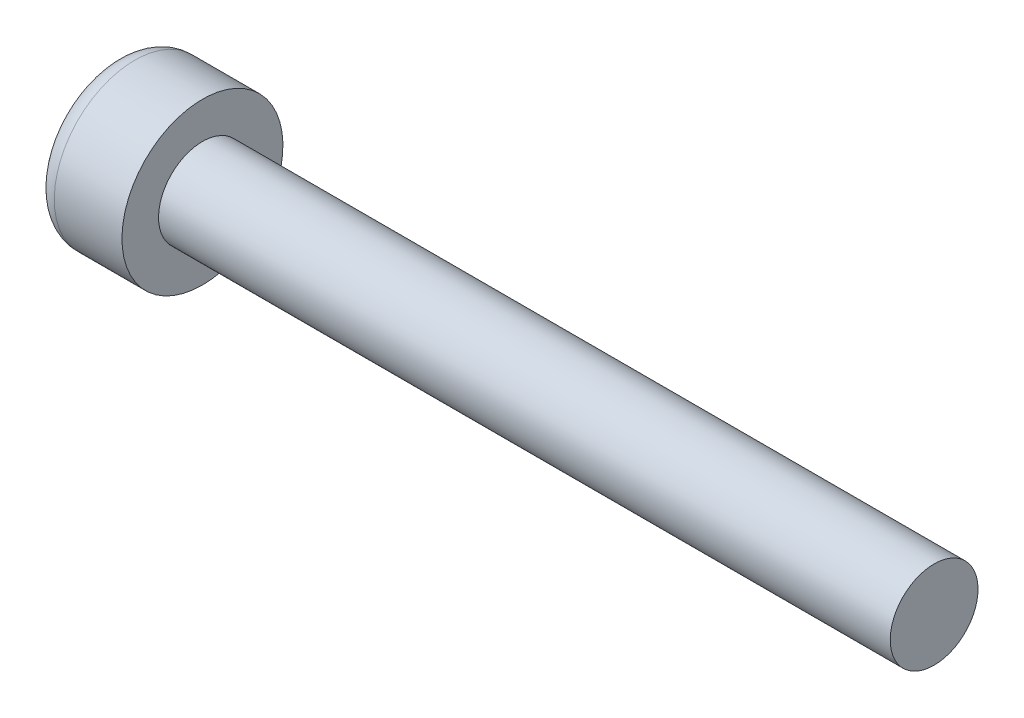
ISO-10303-21;
HEADER;
FILE_DESCRIPTION(('STEP AP214'),'2;1');
FILE_NAME('part.step','',(''),(''),'','','');
FILE_SCHEMA(('AUTOMOTIVE_DESIGN { 1 0 10303 214 1 1 1 1 }'));
ENDSEC;
DATA;
#1=APPLICATION_CONTEXT('core data for automotive mechanical design processes');
#2=APPLICATION_PROTOCOL_DEFINITION('international standard','automotive_design',2000,#1);
#3=PRODUCT_CONTEXT('',#1,'mechanical');
#4=PRODUCT('Part','Part','',(#3));
#5=PRODUCT_RELATED_PRODUCT_CATEGORY('part','',(#4));
#6=PRODUCT_DEFINITION_FORMATION('','',#4);
#7=PRODUCT_DEFINITION_CONTEXT('part definition',#1,'design');
#8=PRODUCT_DEFINITION('design','',#6,#7);
#9=PRODUCT_DEFINITION_SHAPE('','',#8);
#10=(LENGTH_UNIT() NAMED_UNIT(*) SI_UNIT(.MILLI.,.METRE.));
#11=(NAMED_UNIT(*) PLANE_ANGLE_UNIT() SI_UNIT($,.RADIAN.));
#12=(NAMED_UNIT(*) SI_UNIT($,.STERADIAN.) SOLID_ANGLE_UNIT());
#13=UNCERTAINTY_MEASURE_WITH_UNIT(LENGTH_MEASURE(1.E-05),#10,'distance_accuracy_value','');
#14=(GEOMETRIC_REPRESENTATION_CONTEXT(3) GLOBAL_UNCERTAINTY_ASSIGNED_CONTEXT((#13)) GLOBAL_UNIT_ASSIGNED_CONTEXT((#10,
#11,#12)) REPRESENTATION_CONTEXT('',''));
#15=CARTESIAN_POINT('',(0.,0.,0.));
#16=DIRECTION('',(0.,0.,1.));
#17=DIRECTION('',(1.,0.,0.));
#18=AXIS2_PLACEMENT_3D('',#15,#16,#17);
#19=CARTESIAN_POINT('',(0.,0.,0.));
#20=DIRECTION('',(1.,0.,0.));
#21=DIRECTION('',(0.,1.,0.));
#22=AXIS2_PLACEMENT_3D('',#19,#20,#21);
#23=PLANE('',#22);
#24=DIRECTION('',(0.,-0.5,-0.866025403784438));
#25=VECTOR('',#24,1.);
#26=CARTESIAN_POINT('',(0.,1.44337567297406,0.));
#27=LINE('',#26,#25);
#28=CARTESIAN_POINT('',(0.,1.44337567297406,0.));
#29=VERTEX_POINT('',#28);
#30=CARTESIAN_POINT('',(0.,0.721687836487031,-1.25));
#31=VERTEX_POINT('',#30);
#32=EDGE_CURVE('E121',#29,#31,#27,.T.);
#33=ORIENTED_EDGE('',*,*,#32,.F.);
#34=DIRECTION('',(0.,0.5,-0.866025403784439));
#35=VECTOR('',#34,1.);
#36=CARTESIAN_POINT('',(0.,0.721687836487032,1.25));
#37=LINE('',#36,#35);
#38=CARTESIAN_POINT('',(0.,0.721687836487032,1.25));
#39=VERTEX_POINT('',#38);
#40=EDGE_CURVE('E47',#39,#29,#37,.T.);
#41=ORIENTED_EDGE('',*,*,#40,.F.);
#42=DIRECTION('',(0.,1.,0.));
#43=VECTOR('',#42,1.);
#44=CARTESIAN_POINT('',(0.,-0.721687836487031,1.25));
#45=LINE('',#44,#43);
#46=CARTESIAN_POINT('',(0.,-0.721687836487031,1.25));
#47=VERTEX_POINT('',#46);
#48=EDGE_CURVE('E130',#47,#39,#45,.T.);
#49=ORIENTED_EDGE('',*,*,#48,.F.);
#50=DIRECTION('',(0.,0.5,0.866025403784439));
#51=VECTOR('',#50,1.);
#52=CARTESIAN_POINT('',(0.,-1.44337567297406,0.));
#53=LINE('',#52,#51);
#54=CARTESIAN_POINT('',(0.,-1.44337567297406,0.));
#55=VERTEX_POINT('',#54);
#56=EDGE_CURVE('E128',#55,#47,#53,.T.);
#57=ORIENTED_EDGE('',*,*,#56,.F.);
#58=DIRECTION('',(0.,-0.5,0.866025403784438));
#59=VECTOR('',#58,1.);
#60=CARTESIAN_POINT('',(0.,-0.721687836487032,-1.25));
#61=LINE('',#60,#59);
#62=CARTESIAN_POINT('',(0.,-0.721687836487032,-1.25));
#63=VERTEX_POINT('',#62);
#64=EDGE_CURVE('E95',#63,#55,#61,.T.);
#65=ORIENTED_EDGE('',*,*,#64,.F.);
#66=DIRECTION('',(0.,-1.,0.));
#67=VECTOR('',#66,1.);
#68=CARTESIAN_POINT('',(0.,0.721687836487031,-1.25));
#69=LINE('',#68,#67);
#70=EDGE_CURVE('E124',#31,#63,#69,.T.);
#71=ORIENTED_EDGE('',*,*,#70,.F.);
#72=EDGE_LOOP('',(#33,#41,#49,#57,#65,#71));
#73=FACE_BOUND('',#72,.T.);
#74=CARTESIAN_POINT('',(0.,0.,0.));
#75=DIRECTION('',(-1.,0.,0.));
#76=DIRECTION('',(0.,-1.,0.));
#77=AXIS2_PLACEMENT_3D('',#74,#75,#76);
#78=CIRCLE('',#77,2.0625);
#79=CARTESIAN_POINT('',(0.,-2.0625,0.));
#80=VERTEX_POINT('',#79);
#81=EDGE_CURVE('E11',#80,#80,#78,.T.);
#82=ORIENTED_EDGE('',*,*,#81,.T.);
#83=EDGE_LOOP('',(#82));
#84=FACE_BOUND('',#83,.T.);
#85=ADVANCED_FACE('F33',(#73,#84),#23,.F.);
#86=CARTESIAN_POINT('',(0.6875,0.,0.));
#87=DIRECTION('',(-1.,0.,0.));
#88=DIRECTION('',(0.,-1.,0.));
#89=AXIS2_PLACEMENT_3D('',#86,#87,#88);
#90=TOROIDAL_SURFACE('',#89,2.0625,0.6875);
#91=ORIENTED_EDGE('',*,*,#81,.F.);
#92=EDGE_LOOP('',(#91));
#93=FACE_BOUND('',#92,.T.);
#94=CARTESIAN_POINT('',(0.6875,0.,0.));
#95=DIRECTION('',(-1.,0.,0.));
#96=DIRECTION('',(0.,-1.,0.));
#97=AXIS2_PLACEMENT_3D('',#94,#95,#96);
#98=CIRCLE('',#97,2.75);
#99=CARTESIAN_POINT('',(0.687500000000001,-2.75,0.));
#100=VERTEX_POINT('',#99);
#101=EDGE_CURVE('E40',#100,#100,#98,.T.);
#102=ORIENTED_EDGE('',*,*,#101,.T.);
#103=EDGE_LOOP('',(#102));
#104=FACE_BOUND('',#103,.T.);
#105=ADVANCED_FACE('F150',(#93,#104),#90,.T.);
#106=CARTESIAN_POINT('',(0.,0.,0.));
#107=DIRECTION('',(-1.,0.,0.));
#108=DIRECTION('',(0.,-1.,0.));
#109=AXIS2_PLACEMENT_3D('',#106,#107,#108);
#110=CYLINDRICAL_SURFACE('',#109,2.75);
#111=ORIENTED_EDGE('',*,*,#101,.F.);
#112=EDGE_LOOP('',(#111));
#113=FACE_BOUND('',#112,.T.);
#114=CARTESIAN_POINT('',(3.,0.,0.));
#115=DIRECTION('',(-1.,0.,0.));
#116=DIRECTION('',(0.,-1.,0.));
#117=AXIS2_PLACEMENT_3D('',#114,#115,#116);
#118=CIRCLE('',#117,2.75);
#119=CARTESIAN_POINT('',(3.,-2.75,0.));
#120=VERTEX_POINT('',#119);
#121=EDGE_CURVE('E145',#120,#120,#118,.T.);
#122=ORIENTED_EDGE('',*,*,#121,.T.);
#123=EDGE_LOOP('',(#122));
#124=FACE_BOUND('',#123,.T.);
#125=ADVANCED_FACE('F152',(#113,#124),#110,.T.);
#126=CARTESIAN_POINT('',(3.,2.75,0.));
#127=DIRECTION('',(-1.,0.,0.));
#128=DIRECTION('',(0.,-1.,0.));
#129=AXIS2_PLACEMENT_3D('',#126,#127,#128);
#130=PLANE('',#129);
#131=ORIENTED_EDGE('',*,*,#121,.F.);
#132=EDGE_LOOP('',(#131));
#133=FACE_BOUND('',#132,.T.);
#134=CARTESIAN_POINT('',(3.,0.,0.));
#135=DIRECTION('',(-1.,0.,0.));
#136=DIRECTION('',(0.,-1.,0.));
#137=AXIS2_PLACEMENT_3D('',#134,#135,#136);
#138=CIRCLE('',#137,1.5);
#139=CARTESIAN_POINT('',(3.,-1.5,0.));
#140=VERTEX_POINT('',#139);
#141=EDGE_CURVE('E142',#140,#140,#138,.T.);
#142=ORIENTED_EDGE('',*,*,#141,.T.);
#143=EDGE_LOOP('',(#142));
#144=FACE_BOUND('',#143,.T.);
#145=ADVANCED_FACE('F155',(#133,#144),#130,.F.);
#146=CARTESIAN_POINT('',(0.,0.,0.));
#147=DIRECTION('',(-1.,0.,0.));
#148=DIRECTION('',(0.,-1.,0.));
#149=AXIS2_PLACEMENT_3D('',#146,#147,#148);
#150=CYLINDRICAL_SURFACE('',#149,1.5);
#151=ORIENTED_EDGE('',*,*,#141,.F.);
#152=EDGE_LOOP('',(#151));
#153=FACE_BOUND('',#152,.T.);
#154=CARTESIAN_POINT('',(28.,0.,0.));
#155=DIRECTION('',(-1.,0.,0.));
#156=DIRECTION('',(0.,-1.,0.));
#157=AXIS2_PLACEMENT_3D('',#154,#155,#156);
#158=CIRCLE('',#157,1.49999999999999);
#159=CARTESIAN_POINT('',(28.,-1.49999999999999,0.));
#160=VERTEX_POINT('',#159);
#161=EDGE_CURVE('E134',#160,#160,#158,.T.);
#162=ORIENTED_EDGE('',*,*,#161,.T.);
#163=EDGE_LOOP('',(#162));
#164=FACE_BOUND('',#163,.T.);
#165=ADVANCED_FACE('F161',(#153,#164),#150,.T.);
#166=CARTESIAN_POINT('',(28.,1.5,0.));
#167=DIRECTION('',(-1.,0.,0.));
#168=DIRECTION('',(0.,-1.,0.));
#169=AXIS2_PLACEMENT_3D('',#166,#167,#168);
#170=PLANE('',#169);
#171=ORIENTED_EDGE('',*,*,#161,.F.);
#172=EDGE_LOOP('',(#171));
#173=FACE_BOUND('',#172,.T.);
#174=ADVANCED_FACE('F167',(#173),#170,.F.);
#175=CARTESIAN_POINT('',(1.5,0.721687836487032,1.25));
#176=DIRECTION('',(0.,0.866025403784438,0.5));
#177=DIRECTION('',(0.,-0.5,0.866025403784439));
#178=AXIS2_PLACEMENT_3D('',#175,#176,#177);
#179=PLANE('',#178);
#180=ORIENTED_EDGE('',*,*,#40,.T.);
#181=DIRECTION('',(-1.,0.,0.));
#182=VECTOR('',#181,1.);
#183=CARTESIAN_POINT('',(1.5,1.44337567297406,0.));
#184=LINE('',#183,#182);
#185=CARTESIAN_POINT('',(1.5,1.44337567297406,0.));
#186=VERTEX_POINT('',#185);
#187=EDGE_CURVE('E77',#186,#29,#184,.T.);
#188=ORIENTED_EDGE('',*,*,#187,.F.);
#189=DIRECTION('',(0.,0.5,-0.866025403784439));
#190=VECTOR('',#189,1.);
#191=CARTESIAN_POINT('',(1.5,0.721687836487032,1.25));
#192=LINE('',#191,#190);
#193=CARTESIAN_POINT('',(1.5,0.721687836487032,1.25));
#194=VERTEX_POINT('',#193);
#195=EDGE_CURVE('E132',#194,#186,#192,.T.);
#196=ORIENTED_EDGE('',*,*,#195,.F.);
#197=DIRECTION('',(-1.,0.,0.));
#198=VECTOR('',#197,1.);
#199=CARTESIAN_POINT('',(1.5,0.721687836487032,1.25));
#200=LINE('',#199,#198);
#201=EDGE_CURVE('E55',#194,#39,#200,.T.);
#202=ORIENTED_EDGE('',*,*,#201,.T.);
#203=EDGE_LOOP('',(#180,#188,#196,#202));
#204=FACE_BOUND('',#203,.T.);
#205=ADVANCED_FACE('F172',(#204),#179,.F.);
#206=CARTESIAN_POINT('',(1.5,-0.721687836487031,1.25));
#207=DIRECTION('',(0.,0.,1.));
#208=DIRECTION('',(1.,0.,0.));
#209=AXIS2_PLACEMENT_3D('',#206,#207,#208);
#210=PLANE('',#209);
#211=ORIENTED_EDGE('',*,*,#48,.T.);
#212=ORIENTED_EDGE('',*,*,#201,.F.);
#213=DIRECTION('',(0.,1.,0.));
#214=VECTOR('',#213,1.);
#215=CARTESIAN_POINT('',(1.5,-0.721687836487031,1.25));
#216=LINE('',#215,#214);
#217=CARTESIAN_POINT('',(1.5,-0.721687836487031,1.25));
#218=VERTEX_POINT('',#217);
#219=EDGE_CURVE('E107',#218,#194,#216,.T.);
#220=ORIENTED_EDGE('',*,*,#219,.F.);
#221=DIRECTION('',(-1.,0.,0.));
#222=VECTOR('',#221,1.);
#223=CARTESIAN_POINT('',(1.5,-0.721687836487031,1.25));
#224=LINE('',#223,#222);
#225=EDGE_CURVE('E99',#218,#47,#224,.T.);
#226=ORIENTED_EDGE('',*,*,#225,.T.);
#227=EDGE_LOOP('',(#211,#212,#220,#226));
#228=FACE_BOUND('',#227,.T.);
#229=ADVANCED_FACE('F177',(#228),#210,.F.);
#230=CARTESIAN_POINT('',(1.5,-1.44337567297406,0.));
#231=DIRECTION('',(0.,-0.866025403784439,0.5));
#232=DIRECTION('',(0.,-0.5,-0.866025403784439));
#233=AXIS2_PLACEMENT_3D('',#230,#231,#232);
#234=PLANE('',#233);
#235=ORIENTED_EDGE('',*,*,#56,.T.);
#236=ORIENTED_EDGE('',*,*,#225,.F.);
#237=DIRECTION('',(0.,0.5,0.866025403784439));
#238=VECTOR('',#237,1.);
#239=CARTESIAN_POINT('',(1.5,-1.44337567297406,0.));
#240=LINE('',#239,#238);
#241=CARTESIAN_POINT('',(1.5,-1.44337567297406,0.));
#242=VERTEX_POINT('',#241);
#243=EDGE_CURVE('E103',#242,#218,#240,.T.);
#244=ORIENTED_EDGE('',*,*,#243,.F.);
#245=DIRECTION('',(-1.,0.,0.));
#246=VECTOR('',#245,1.);
#247=CARTESIAN_POINT('',(1.5,-1.44337567297406,0.));
#248=LINE('',#247,#246);
#249=EDGE_CURVE('E88',#242,#55,#248,.T.);
#250=ORIENTED_EDGE('',*,*,#249,.T.);
#251=EDGE_LOOP('',(#235,#236,#244,#250));
#252=FACE_BOUND('',#251,.T.);
#253=ADVANCED_FACE('F104',(#252),#234,.F.);
#254=CARTESIAN_POINT('',(1.5,-0.721687836487032,-1.25));
#255=DIRECTION('',(0.,-0.866025403784438,-0.5));
#256=DIRECTION('',(0.,0.5,-0.866025403784438));
#257=AXIS2_PLACEMENT_3D('',#254,#255,#256);
#258=PLANE('',#257);
#259=ORIENTED_EDGE('',*,*,#64,.T.);
#260=ORIENTED_EDGE('',*,*,#249,.F.);
#261=DIRECTION('',(0.,-0.5,0.866025403784438));
#262=VECTOR('',#261,1.);
#263=CARTESIAN_POINT('',(1.5,-0.721687836487032,-1.25));
#264=LINE('',#263,#262);
#265=CARTESIAN_POINT('',(1.5,-0.721687836487032,-1.25));
#266=VERTEX_POINT('',#265);
#267=EDGE_CURVE('E92',#266,#242,#264,.T.);
#268=ORIENTED_EDGE('',*,*,#267,.F.);
#269=DIRECTION('',(-1.,0.,0.));
#270=VECTOR('',#269,1.);
#271=CARTESIAN_POINT('',(1.5,-0.721687836487032,-1.25));
#272=LINE('',#271,#270);
#273=EDGE_CURVE('E100',#266,#63,#272,.T.);
#274=ORIENTED_EDGE('',*,*,#273,.T.);
#275=EDGE_LOOP('',(#259,#260,#268,#274));
#276=FACE_BOUND('',#275,.T.);
#277=ADVANCED_FACE('F90',(#276),#258,.F.);
#278=CARTESIAN_POINT('',(1.5,0.721687836487031,-1.25));
#279=DIRECTION('',(0.,0.,-1.));
#280=DIRECTION('',(-1.,0.,0.));
#281=AXIS2_PLACEMENT_3D('',#278,#279,#280);
#282=PLANE('',#281);
#283=ORIENTED_EDGE('',*,*,#70,.T.);
#284=ORIENTED_EDGE('',*,*,#273,.F.);
#285=DIRECTION('',(0.,-1.,0.));
#286=VECTOR('',#285,1.);
#287=CARTESIAN_POINT('',(1.5,0.721687836487031,-1.25));
#288=LINE('',#287,#286);
#289=CARTESIAN_POINT('',(1.5,0.721687836487031,-1.25));
#290=VERTEX_POINT('',#289);
#291=EDGE_CURVE('E113',#290,#266,#288,.T.);
#292=ORIENTED_EDGE('',*,*,#291,.F.);
#293=DIRECTION('',(-1.,0.,0.));
#294=VECTOR('',#293,1.);
#295=CARTESIAN_POINT('',(1.5,0.721687836487031,-1.25));
#296=LINE('',#295,#294);
#297=EDGE_CURVE('E137',#290,#31,#296,.T.);
#298=ORIENTED_EDGE('',*,*,#297,.T.);
#299=EDGE_LOOP('',(#283,#284,#292,#298));
#300=FACE_BOUND('',#299,.T.);
#301=ADVANCED_FACE('F203',(#300),#282,.F.);
#302=CARTESIAN_POINT('',(1.5,1.44337567297406,0.));
#303=DIRECTION('',(0.,0.866025403784438,-0.5));
#304=DIRECTION('',(0.,0.5,0.866025403784439));
#305=AXIS2_PLACEMENT_3D('',#302,#303,#304);
#306=PLANE('',#305);
#307=ORIENTED_EDGE('',*,*,#32,.T.);
#308=ORIENTED_EDGE('',*,*,#297,.F.);
#309=DIRECTION('',(0.,-0.5,-0.866025403784438));
#310=VECTOR('',#309,1.);
#311=CARTESIAN_POINT('',(1.5,1.44337567297406,0.));
#312=LINE('',#311,#310);
#313=EDGE_CURVE('E115',#186,#290,#312,.T.);
#314=ORIENTED_EDGE('',*,*,#313,.F.);
#315=ORIENTED_EDGE('',*,*,#187,.T.);
#316=EDGE_LOOP('',(#307,#308,#314,#315));
#317=FACE_BOUND('',#316,.T.);
#318=ADVANCED_FACE('F191',(#317),#306,.F.);
#319=CARTESIAN_POINT('',(1.5,0.,0.));
#320=DIRECTION('',(-1.,0.,0.));
#321=DIRECTION('',(0.,-1.,0.));
#322=AXIS2_PLACEMENT_3D('',#319,#320,#321);
#323=PLANE('',#322);
#324=ORIENTED_EDGE('',*,*,#195,.T.);
#325=ORIENTED_EDGE('',*,*,#313,.T.);
#326=ORIENTED_EDGE('',*,*,#291,.T.);
#327=ORIENTED_EDGE('',*,*,#267,.T.);
#328=ORIENTED_EDGE('',*,*,#243,.T.);
#329=ORIENTED_EDGE('',*,*,#219,.T.);
#330=EDGE_LOOP('',(#324,#325,#326,#327,#328,#329));
#331=FACE_BOUND('',#330,.T.);
#332=ADVANCED_FACE('F110',(#331),#323,.T.);
#333=CLOSED_SHELL('',(#85,#105,#125,#145,#165,#174,#205,#229,#253,#277,#301,#318,#332));
#334=MANIFOLD_SOLID_BREP('B2',#333);
#335=ADVANCED_BREP_SHAPE_REPRESENTATION('',(#18,#334),#14);
#336=SHAPE_DEFINITION_REPRESENTATION(#9,#335);
ENDSEC;
END-ISO-10303-21;
